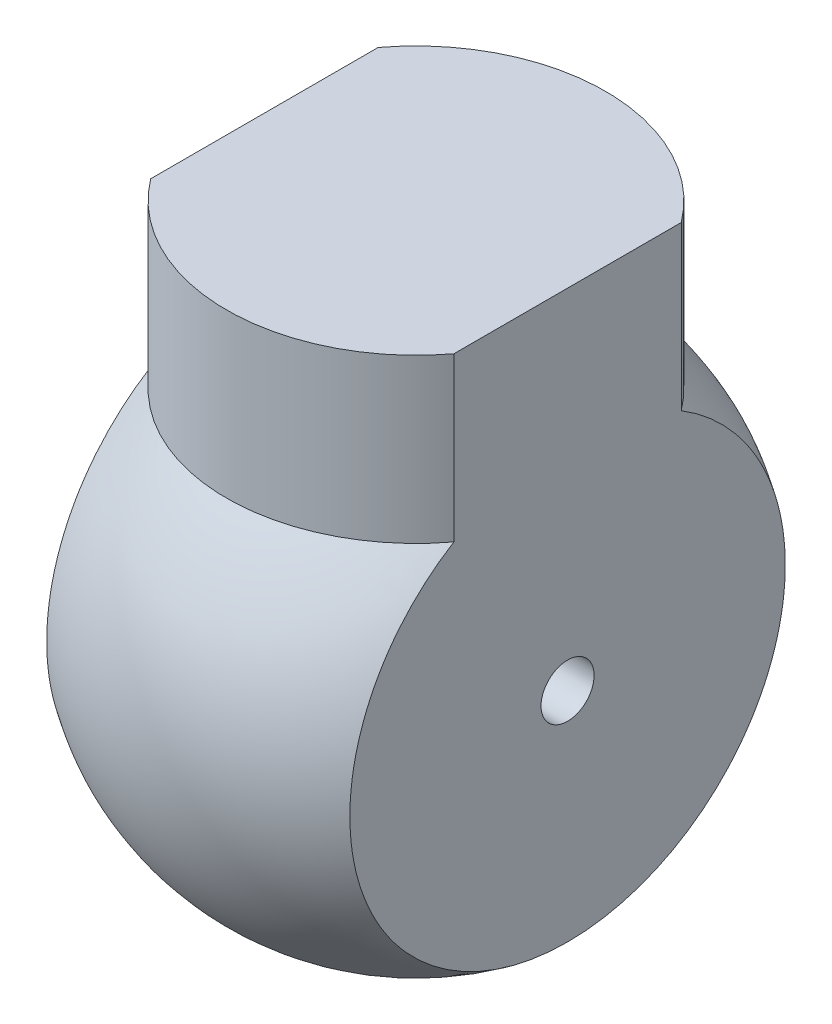
ISO-10303-21;
HEADER;
FILE_DESCRIPTION(('STEP AP214'),'2;1');
FILE_NAME('part.step','',(''),(''),'','','');
FILE_SCHEMA(('AUTOMOTIVE_DESIGN { 1 0 10303 214 1 1 1 1 }'));
ENDSEC;
DATA;
#1=APPLICATION_CONTEXT('core data for automotive mechanical design processes');
#2=APPLICATION_PROTOCOL_DEFINITION('international standard','automotive_design',2000,#1);
#3=PRODUCT_CONTEXT('',#1,'mechanical');
#4=PRODUCT('Part','Part','',(#3));
#5=PRODUCT_RELATED_PRODUCT_CATEGORY('part','',(#4));
#6=PRODUCT_DEFINITION_FORMATION('','',#4);
#7=PRODUCT_DEFINITION_CONTEXT('part definition',#1,'design');
#8=PRODUCT_DEFINITION('design','',#6,#7);
#9=PRODUCT_DEFINITION_SHAPE('','',#8);
#10=(LENGTH_UNIT() NAMED_UNIT(*) SI_UNIT(.MILLI.,.METRE.));
#11=(NAMED_UNIT(*) PLANE_ANGLE_UNIT() SI_UNIT($,.RADIAN.));
#12=(NAMED_UNIT(*) SI_UNIT($,.STERADIAN.) SOLID_ANGLE_UNIT());
#13=UNCERTAINTY_MEASURE_WITH_UNIT(LENGTH_MEASURE(1.E-05),#10,'distance_accuracy_value','');
#14=(GEOMETRIC_REPRESENTATION_CONTEXT(3) GLOBAL_UNCERTAINTY_ASSIGNED_CONTEXT((#13)) GLOBAL_UNIT_ASSIGNED_CONTEXT((#10,
#11,#12)) REPRESENTATION_CONTEXT('',''));
#15=CARTESIAN_POINT('',(0.,0.,0.));
#16=DIRECTION('',(0.,0.,1.));
#17=DIRECTION('',(1.,0.,0.));
#18=AXIS2_PLACEMENT_3D('',#15,#16,#17);
#19=CARTESIAN_POINT('',(0.,4.8711455665272,0.));
#20=DIRECTION('',(0.,0.,-1.));
#21=DIRECTION('',(1.,0.,0.));
#22=AXIS2_PLACEMENT_3D('',#19,#20,#21);
#23=SPHERICAL_SURFACE('',#22,8.001);
#24=CARTESIAN_POINT('',(0.,10.4706791185296,0.));
#25=DIRECTION('',(0.,-1.,0.));
#26=DIRECTION('',(0.,0.,-1.));
#27=AXIS2_PLACEMENT_3D('',#24,#25,#26);
#28=CIRCLE('',#27,5.715);
#29=CARTESIAN_POINT('',(-4.572,10.4706791185295,3.429));
#30=VERTEX_POINT('',#29);
#31=CARTESIAN_POINT('',(4.572,10.4706791185296,3.429));
#32=VERTEX_POINT('',#31);
#33=EDGE_CURVE('E95',#30,#32,#28,.F.);
#34=ORIENTED_EDGE('',*,*,#33,.F.);
#35=CARTESIAN_POINT('',(-4.572,4.8711455665272,0.));
#36=DIRECTION('',(1.,0.,0.));
#37=DIRECTION('',(0.,0.,-1.));
#38=AXIS2_PLACEMENT_3D('',#35,#36,#37);
#39=CIRCLE('',#38,6.56603510499297);
#40=CARTESIAN_POINT('',(-4.572,10.4706791185295,-3.429));
#41=VERTEX_POINT('',#40);
#42=EDGE_CURVE('E42',#41,#30,#39,.F.);
#43=ORIENTED_EDGE('',*,*,#42,.F.);
#44=CARTESIAN_POINT('',(0.,10.4706791185296,0.));
#45=DIRECTION('',(0.,-1.,0.));
#46=DIRECTION('',(0.,0.,-1.));
#47=AXIS2_PLACEMENT_3D('',#44,#45,#46);
#48=CIRCLE('',#47,5.715);
#49=CARTESIAN_POINT('',(4.572,10.4706791185296,-3.429));
#50=VERTEX_POINT('',#49);
#51=EDGE_CURVE('E96',#50,#41,#48,.F.);
#52=ORIENTED_EDGE('',*,*,#51,.F.);
#53=CARTESIAN_POINT('',(4.572,4.8711455665272,0.));
#54=DIRECTION('',(-1.,0.,0.));
#55=DIRECTION('',(0.,0.,1.));
#56=AXIS2_PLACEMENT_3D('',#53,#54,#55);
#57=CIRCLE('',#56,6.56603510499297);
#58=EDGE_CURVE('E11',#32,#50,#57,.F.);
#59=ORIENTED_EDGE('',*,*,#58,.F.);
#60=EDGE_LOOP('',(#34,#43,#52,#59));
#61=FACE_BOUND('',#60,.T.);
#62=ADVANCED_FACE('F35',(#61),#23,.T.);
#63=CARTESIAN_POINT('',(4.572,12.8723741665272,6.56603510499297));
#64=DIRECTION('',(-1.,0.,0.));
#65=DIRECTION('',(0.,0.,1.));
#66=AXIS2_PLACEMENT_3D('',#63,#64,#65);
#67=PLANE('',#66);
#68=CARTESIAN_POINT('',(4.572,4.8711455665272,0.));
#69=DIRECTION('',(-1.,0.,0.));
#70=DIRECTION('',(0.,0.,1.));
#71=AXIS2_PLACEMENT_3D('',#68,#69,#70);
#72=CIRCLE('',#71,0.8001);
#73=CARTESIAN_POINT('',(4.572,4.8711455665272,0.800099999999998));
#74=VERTEX_POINT('',#73);
#75=EDGE_CURVE('E115',#74,#74,#72,.T.);
#76=ORIENTED_EDGE('',*,*,#75,.T.);
#77=EDGE_LOOP('',(#76));
#78=FACE_BOUND('',#77,.T.);
#79=ORIENTED_EDGE('',*,*,#58,.T.);
#80=DIRECTION('',(0.,-1.,0.));
#81=VECTOR('',#80,1.);
#82=CARTESIAN_POINT('',(4.572,15.3867455665272,-3.429));
#83=LINE('',#82,#81);
#84=CARTESIAN_POINT('',(4.572,15.3867455665272,-3.429));
#85=VERTEX_POINT('',#84);
#86=EDGE_CURVE('E84',#85,#50,#83,.T.);
#87=ORIENTED_EDGE('',*,*,#86,.F.);
#88=DIRECTION('',(0.,0.,-1.));
#89=VECTOR('',#88,1.);
#90=CARTESIAN_POINT('',(4.572,15.3867455665272,-3.429));
#91=LINE('',#90,#89);
#92=CARTESIAN_POINT('',(4.572,15.3867455665272,3.429));
#93=VERTEX_POINT('',#92);
#94=EDGE_CURVE('E78',#93,#85,#91,.T.);
#95=ORIENTED_EDGE('',*,*,#94,.F.);
#96=DIRECTION('',(0.,-1.,0.));
#97=VECTOR('',#96,1.);
#98=CARTESIAN_POINT('',(4.572,15.3867455665272,3.429));
#99=LINE('',#98,#97);
#100=EDGE_CURVE('E82',#93,#32,#99,.T.);
#101=ORIENTED_EDGE('',*,*,#100,.T.);
#102=EDGE_LOOP('',(#79,#87,#95,#101));
#103=FACE_BOUND('',#102,.T.);
#104=ADVANCED_FACE('F80',(#78,#103),#67,.F.);
#105=CARTESIAN_POINT('',(-4.572,12.8723741665272,6.56603510499297));
#106=DIRECTION('',(1.,0.,0.));
#107=DIRECTION('',(0.,0.,-1.));
#108=AXIS2_PLACEMENT_3D('',#105,#106,#107);
#109=PLANE('',#108);
#110=CARTESIAN_POINT('',(-4.572,4.8711455665272,0.));
#111=DIRECTION('',(-1.,0.,0.));
#112=DIRECTION('',(0.,0.,1.));
#113=AXIS2_PLACEMENT_3D('',#110,#111,#112);
#114=CIRCLE('',#113,0.8001);
#115=CARTESIAN_POINT('',(-4.572,4.8711455665272,0.800099999999998));
#116=VERTEX_POINT('',#115);
#117=EDGE_CURVE('E112',#116,#116,#114,.T.);
#118=ORIENTED_EDGE('',*,*,#117,.F.);
#119=EDGE_LOOP('',(#118));
#120=FACE_BOUND('',#119,.T.);
#121=ORIENTED_EDGE('',*,*,#42,.T.);
#122=DIRECTION('',(0.,-1.,0.));
#123=VECTOR('',#122,1.);
#124=CARTESIAN_POINT('',(-4.572,15.3867455665272,3.429));
#125=LINE('',#124,#123);
#126=CARTESIAN_POINT('',(-4.572,15.3867455665272,3.429));
#127=VERTEX_POINT('',#126);
#128=EDGE_CURVE('E57',#127,#30,#125,.T.);
#129=ORIENTED_EDGE('',*,*,#128,.F.);
#130=DIRECTION('',(0.,0.,1.));
#131=VECTOR('',#130,1.);
#132=CARTESIAN_POINT('',(-4.572,15.3867455665272,-3.429));
#133=LINE('',#132,#131);
#134=CARTESIAN_POINT('',(-4.572,15.3867455665272,-3.429));
#135=VERTEX_POINT('',#134);
#136=EDGE_CURVE('E91',#135,#127,#133,.T.);
#137=ORIENTED_EDGE('',*,*,#136,.F.);
#138=DIRECTION('',(0.,-1.,0.));
#139=VECTOR('',#138,1.);
#140=CARTESIAN_POINT('',(-4.572,15.3867455665272,-3.429));
#141=LINE('',#140,#139);
#142=EDGE_CURVE('E49',#135,#41,#141,.T.);
#143=ORIENTED_EDGE('',*,*,#142,.T.);
#144=EDGE_LOOP('',(#121,#129,#137,#143));
#145=FACE_BOUND('',#144,.T.);
#146=ADVANCED_FACE('F103',(#120,#145),#109,.F.);
#147=CARTESIAN_POINT('',(0.,15.3867455665272,0.));
#148=DIRECTION('',(0.,-1.,0.));
#149=DIRECTION('',(0.,0.,-1.));
#150=AXIS2_PLACEMENT_3D('',#147,#148,#149);
#151=CYLINDRICAL_SURFACE('',#150,5.715);
#152=ORIENTED_EDGE('',*,*,#128,.T.);
#153=ORIENTED_EDGE('',*,*,#33,.T.);
#154=ORIENTED_EDGE('',*,*,#100,.F.);
#155=CARTESIAN_POINT('',(0.,15.3867455665272,0.));
#156=DIRECTION('',(0.,1.,0.));
#157=DIRECTION('',(0.,0.,1.));
#158=AXIS2_PLACEMENT_3D('',#155,#156,#157);
#159=CIRCLE('',#158,5.715);
#160=EDGE_CURVE('E88',#127,#93,#159,.T.);
#161=ORIENTED_EDGE('',*,*,#160,.F.);
#162=EDGE_LOOP('',(#152,#153,#154,#161));
#163=FACE_BOUND('',#162,.T.);
#164=ADVANCED_FACE('F94',(#163),#151,.T.);
#165=CARTESIAN_POINT('',(0.,15.3867455665272,0.));
#166=DIRECTION('',(0.,-1.,0.));
#167=DIRECTION('',(0.,0.,-1.));
#168=AXIS2_PLACEMENT_3D('',#165,#166,#167);
#169=CYLINDRICAL_SURFACE('',#168,5.715);
#170=ORIENTED_EDGE('',*,*,#86,.T.);
#171=ORIENTED_EDGE('',*,*,#51,.T.);
#172=ORIENTED_EDGE('',*,*,#142,.F.);
#173=CARTESIAN_POINT('',(0.,15.3867455665272,0.));
#174=DIRECTION('',(0.,1.,0.));
#175=DIRECTION('',(0.,0.,1.));
#176=AXIS2_PLACEMENT_3D('',#173,#174,#175);
#177=CIRCLE('',#176,5.715);
#178=EDGE_CURVE('E87',#85,#135,#177,.T.);
#179=ORIENTED_EDGE('',*,*,#178,.F.);
#180=EDGE_LOOP('',(#170,#171,#172,#179));
#181=FACE_BOUND('',#180,.T.);
#182=ADVANCED_FACE('F107',(#181),#169,.T.);
#183=CARTESIAN_POINT('',(0.,15.3867455665272,0.));
#184=DIRECTION('',(0.,1.,0.));
#185=DIRECTION('',(0.,0.,1.));
#186=AXIS2_PLACEMENT_3D('',#183,#184,#185);
#187=PLANE('',#186);
#188=ORIENTED_EDGE('',*,*,#160,.T.);
#189=ORIENTED_EDGE('',*,*,#94,.T.);
#190=ORIENTED_EDGE('',*,*,#178,.T.);
#191=ORIENTED_EDGE('',*,*,#136,.T.);
#192=EDGE_LOOP('',(#188,#189,#190,#191));
#193=FACE_BOUND('',#192,.T.);
#194=ADVANCED_FACE('F90',(#193),#187,.T.);
#195=CARTESIAN_POINT('',(-3.429,4.8711455665272,0.));
#196=DIRECTION('',(-1.,0.,0.));
#197=DIRECTION('',(0.,0.,1.));
#198=AXIS2_PLACEMENT_3D('',#195,#196,#197);
#199=CYLINDRICAL_SURFACE('',#198,0.8001);
#200=CARTESIAN_POINT('',(-3.429,4.8711455665272,0.));
#201=DIRECTION('',(-1.,0.,0.));
#202=DIRECTION('',(0.,0.,1.));
#203=AXIS2_PLACEMENT_3D('',#200,#201,#202);
#204=CIRCLE('',#203,0.8001);
#205=CARTESIAN_POINT('',(-3.429,4.8711455665272,0.800099999999998));
#206=VERTEX_POINT('',#205);
#207=EDGE_CURVE('E92',#206,#206,#204,.T.);
#208=ORIENTED_EDGE('',*,*,#207,.F.);
#209=EDGE_LOOP('',(#208));
#210=FACE_BOUND('',#209,.T.);
#211=ORIENTED_EDGE('',*,*,#117,.T.);
#212=EDGE_LOOP('',(#211));
#213=FACE_BOUND('',#212,.T.);
#214=ADVANCED_FACE('F153',(#210,#213),#199,.F.);
#215=CARTESIAN_POINT('',(-3.429,4.8711455665272,0.));
#216=DIRECTION('',(-1.,0.,0.));
#217=DIRECTION('',(0.,0.,1.));
#218=AXIS2_PLACEMENT_3D('',#215,#216,#217);
#219=PLANE('',#218);
#220=ORIENTED_EDGE('',*,*,#207,.T.);
#221=EDGE_LOOP('',(#220));
#222=FACE_BOUND('',#221,.T.);
#223=ADVANCED_FACE('F129',(#222),#219,.T.);
#224=CARTESIAN_POINT('',(4.572,4.8711455665272,0.));
#225=DIRECTION('',(-1.,0.,0.));
#226=DIRECTION('',(0.,0.,1.));
#227=AXIS2_PLACEMENT_3D('',#224,#225,#226);
#228=CYLINDRICAL_SURFACE('',#227,0.8001);
#229=ORIENTED_EDGE('',*,*,#75,.F.);
#230=EDGE_LOOP('',(#229));
#231=FACE_BOUND('',#230,.T.);
#232=CARTESIAN_POINT('',(3.429,4.8711455665272,0.));
#233=DIRECTION('',(-1.,0.,0.));
#234=DIRECTION('',(0.,0.,1.));
#235=AXIS2_PLACEMENT_3D('',#232,#233,#234);
#236=CIRCLE('',#235,0.8001);
#237=CARTESIAN_POINT('',(3.429,4.8711455665272,0.800099999999998));
#238=VERTEX_POINT('',#237);
#239=EDGE_CURVE('E118',#238,#238,#236,.T.);
#240=ORIENTED_EDGE('',*,*,#239,.T.);
#241=EDGE_LOOP('',(#240));
#242=FACE_BOUND('',#241,.T.);
#243=ADVANCED_FACE('F125',(#231,#242),#228,.F.);
#244=CARTESIAN_POINT('',(3.429,4.8711455665272,0.));
#245=DIRECTION('',(-1.,0.,0.));
#246=DIRECTION('',(0.,0.,1.));
#247=AXIS2_PLACEMENT_3D('',#244,#245,#246);
#248=PLANE('',#247);
#249=ORIENTED_EDGE('',*,*,#239,.F.);
#250=EDGE_LOOP('',(#249));
#251=FACE_BOUND('',#250,.T.);
#252=ADVANCED_FACE('F128',(#251),#248,.F.);
#253=CLOSED_SHELL('',(#62,#104,#146,#164,#182,#194,#214,#223,#243,#252));
#254=MANIFOLD_SOLID_BREP('B2',#253);
#255=ADVANCED_BREP_SHAPE_REPRESENTATION('',(#18,#254),#14);
#256=SHAPE_DEFINITION_REPRESENTATION(#9,#255);
ENDSEC;
END-ISO-10303-21;
